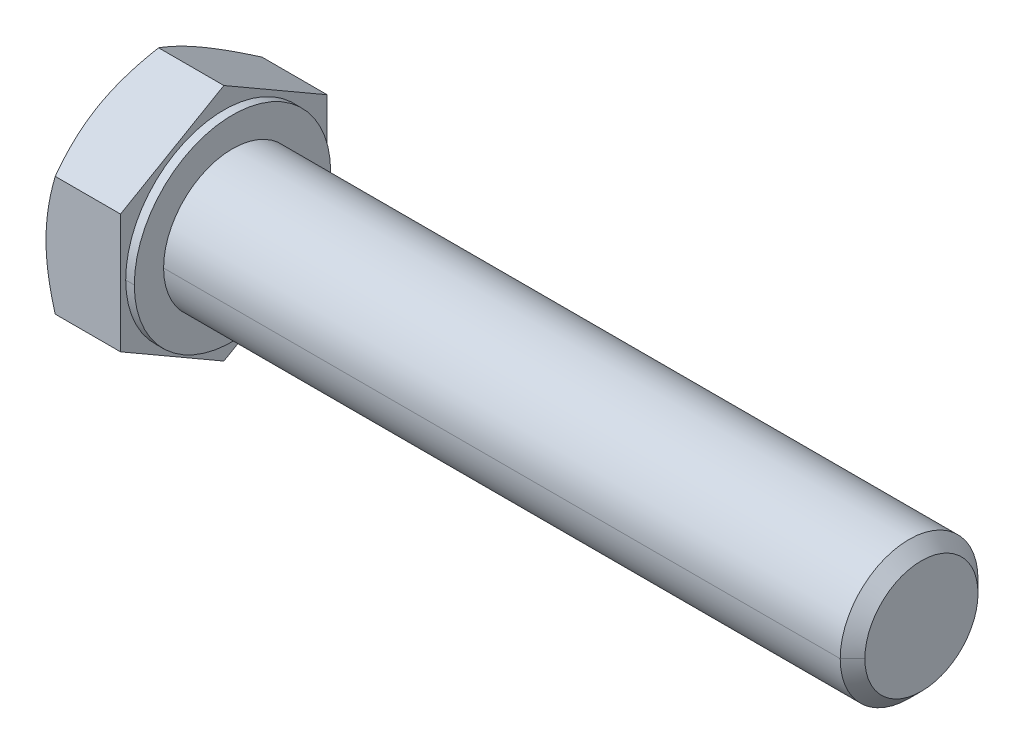
ISO-10303-21;
HEADER;
FILE_DESCRIPTION(('STEP AP214'),'2;1');
FILE_NAME('part.step','',(''),(''),'','','');
FILE_SCHEMA(('AUTOMOTIVE_DESIGN { 1 0 10303 214 1 1 1 1 }'));
ENDSEC;
DATA;
#1=APPLICATION_CONTEXT('core data for automotive mechanical design processes');
#2=APPLICATION_PROTOCOL_DEFINITION('international standard','automotive_design',2000,#1);
#3=PRODUCT_CONTEXT('',#1,'mechanical');
#4=PRODUCT('Part','Part','',(#3));
#5=PRODUCT_RELATED_PRODUCT_CATEGORY('part','',(#4));
#6=PRODUCT_DEFINITION_FORMATION('','',#4);
#7=PRODUCT_DEFINITION_CONTEXT('part definition',#1,'design');
#8=PRODUCT_DEFINITION('design','',#6,#7);
#9=PRODUCT_DEFINITION_SHAPE('','',#8);
#10=(LENGTH_UNIT() NAMED_UNIT(*) SI_UNIT(.MILLI.,.METRE.));
#11=(NAMED_UNIT(*) PLANE_ANGLE_UNIT() SI_UNIT($,.RADIAN.));
#12=(NAMED_UNIT(*) SI_UNIT($,.STERADIAN.) SOLID_ANGLE_UNIT());
#13=UNCERTAINTY_MEASURE_WITH_UNIT(LENGTH_MEASURE(1.E-05),#10,'distance_accuracy_value','');
#14=(GEOMETRIC_REPRESENTATION_CONTEXT(3) GLOBAL_UNCERTAINTY_ASSIGNED_CONTEXT((#13)) GLOBAL_UNIT_ASSIGNED_CONTEXT((#10,
#11,#12)) REPRESENTATION_CONTEXT('',''));
#15=CARTESIAN_POINT('',(0.,0.,0.));
#16=DIRECTION('',(0.,0.,1.));
#17=DIRECTION('',(1.,0.,0.));
#18=AXIS2_PLACEMENT_3D('',#15,#16,#17);
#19=CARTESIAN_POINT('',(-0.75,13.68,0.));
#20=DIRECTION('',(-1.,0.,0.));
#21=DIRECTION('',(0.,0.,1.));
#22=AXIS2_PLACEMENT_3D('',#19,#20,#21);
#23=PLANE('',#22);
#24=CARTESIAN_POINT('',(-0.75,0.,0.));
#25=DIRECTION('',(1.,0.,0.));
#26=DIRECTION('',(0.,0.,-1.));
#27=AXIS2_PLACEMENT_3D('',#24,#25,#26);
#28=CIRCLE('',#27,8.55);
#29=CARTESIAN_POINT('',(-0.75,0.,8.55));
#30=VERTEX_POINT('',#29);
#31=CARTESIAN_POINT('',(-0.75,0.,-8.55));
#32=VERTEX_POINT('',#31);
#33=EDGE_CURVE('E11',#30,#32,#28,.T.);
#34=ORIENTED_EDGE('',*,*,#33,.F.);
#35=CARTESIAN_POINT('',(-0.75,0.,0.));
#36=DIRECTION('',(1.,0.,0.));
#37=DIRECTION('',(0.,0.,-1.));
#38=AXIS2_PLACEMENT_3D('',#35,#36,#37);
#39=CIRCLE('',#38,8.55);
#40=EDGE_CURVE('E26',#32,#30,#39,.T.);
#41=ORIENTED_EDGE('',*,*,#40,.F.);
#42=EDGE_LOOP('',(#34,#41));
#43=FACE_BOUND('',#42,.T.);
#44=DIRECTION('',(0.,1.,0.));
#45=VECTOR('',#44,1.);
#46=CARTESIAN_POINT('',(-0.75,13.68,9.));
#47=LINE('',#46,#45);
#48=CARTESIAN_POINT('',(-0.75,-5.1961524227066,9.));
#49=VERTEX_POINT('',#48);
#50=CARTESIAN_POINT('',(-0.75,5.1961524227066,9.));
#51=VERTEX_POINT('',#50);
#52=EDGE_CURVE('E519',#49,#51,#47,.T.);
#53=ORIENTED_EDGE('',*,*,#52,.F.);
#54=DIRECTION('',(0.,0.499999999999983,0.866025403784449));
#55=VECTOR('',#54,1.);
#56=CARTESIAN_POINT('',(-0.75,-4.37422863406016,10.4236137618852));
#57=LINE('',#56,#55);
#58=CARTESIAN_POINT('',(-0.75,-10.392304845413,0.));
#59=VERTEX_POINT('',#58);
#60=EDGE_CURVE('E520',#59,#49,#57,.T.);
#61=ORIENTED_EDGE('',*,*,#60,.F.);
#62=DIRECTION('',(0.,-0.499999999999983,0.866025403784449));
#63=VECTOR('',#62,1.);
#64=CARTESIAN_POINT('',(-0.75,-4.37422863406016,-10.4236137618852));
#65=LINE('',#64,#63);
#66=CARTESIAN_POINT('',(-0.75,-5.1961524227066,-9.));
#67=VERTEX_POINT('',#66);
#68=EDGE_CURVE('E527',#67,#59,#65,.T.);
#69=ORIENTED_EDGE('',*,*,#68,.F.);
#70=DIRECTION('',(0.,-1.,0.));
#71=VECTOR('',#70,1.);
#72=CARTESIAN_POINT('',(-0.75,13.68,-9.));
#73=LINE('',#72,#71);
#74=CARTESIAN_POINT('',(-0.75,5.1961524227066,-9.));
#75=VERTEX_POINT('',#74);
#76=EDGE_CURVE('E540',#75,#67,#73,.T.);
#77=ORIENTED_EDGE('',*,*,#76,.F.);
#78=DIRECTION('',(0.,-0.499999999999983,-0.866025403784449));
#79=VECTOR('',#78,1.);
#80=CARTESIAN_POINT('',(-0.75,11.2142286340597,1.42361376188564));
#81=LINE('',#80,#79);
#82=CARTESIAN_POINT('',(-0.75,10.392304845413,0.));
#83=VERTEX_POINT('',#82);
#84=EDGE_CURVE('E271',#83,#75,#81,.T.);
#85=ORIENTED_EDGE('',*,*,#84,.F.);
#86=DIRECTION('',(0.,0.499999999999983,-0.866025403784449));
#87=VECTOR('',#86,1.);
#88=CARTESIAN_POINT('',(-0.75,11.2142286340597,-1.42361376188564));
#89=LINE('',#88,#87);
#90=EDGE_CURVE('E265',#51,#83,#89,.T.);
#91=ORIENTED_EDGE('',*,*,#90,.F.);
#92=EDGE_LOOP('',(#53,#61,#69,#77,#85,#91));
#93=FACE_BOUND('',#92,.T.);
#94=ADVANCED_FACE('F17',(#43,#93),#23,.F.);
#95=CARTESIAN_POINT('',(-7.5,10.392304845413,0.));
#96=DIRECTION('',(0.,0.866025403784449,0.499999999999983));
#97=DIRECTION('',(0.,-0.499999999999983,0.866025403784449));
#98=AXIS2_PLACEMENT_3D('',#95,#96,#97);
#99=PLANE('',#98);
#100=CARTESIAN_POINT('',(-6.43627813379369,10.3924203154668,-0.000200000000001183));
#101=CARTESIAN_POINT('',(-6.69621058875829,9.942219103389,0.779571372947934));
#102=CARTESIAN_POINT('',(-6.91171855275249,9.47976438328523,1.58056644436775));
#103=CARTESIAN_POINT('',(-7.19216806037815,8.55314341169682,3.18552104651779));
#104=CARTESIAN_POINT('',(-7.2580045970672,8.07792815738971,4.00861801150951));
#105=CARTESIAN_POINT('',(-7.21650725145066,7.20186794871736,5.52599880341949));
#106=CARTESIAN_POINT('',(-7.13122965941731,6.79157607035014,6.23664518268441));
#107=CARTESIAN_POINT('',(-6.85476074123532,5.98793750945468,7.62858800107694));
#108=CARTESIAN_POINT('',(-6.66244767905362,5.58776103891603,8.32171398004351));
#109=CARTESIAN_POINT('',(-6.43627813379354,5.19603695265277,9.0002));
#110=B_SPLINE_CURVE_WITH_KNOTS('',3,(#100,#101,#102,#103,#104,#105,#106,#107,#108,#109),
.UNSPECIFIED.,.F.,.F.,(4,2,2,2,4),(0.,0.267364107578722,0.534728215157443,0.767364107578722,1.),.UNSPECIFIED.);
#111=CARTESIAN_POINT('',(-6.43634480157145,10.392304845413,0.));
#112=VERTEX_POINT('',#111);
#113=CARTESIAN_POINT('',(-6.43634480157131,5.1961524227066,9.));
#114=VERTEX_POINT('',#113);
#115=EDGE_CURVE('E257',#112,#114,#110,.T.);
#116=ORIENTED_EDGE('',*,*,#115,.T.);
#117=DIRECTION('',(1.,0.,0.));
#118=VECTOR('',#117,1.);
#119=CARTESIAN_POINT('',(-7.5,5.1961524227066,9.));
#120=LINE('',#119,#118);
#121=EDGE_CURVE('E266',#114,#51,#120,.T.);
#122=ORIENTED_EDGE('',*,*,#121,.T.);
#123=ORIENTED_EDGE('',*,*,#90,.T.);
#124=DIRECTION('',(1.,0.,0.));
#125=VECTOR('',#124,1.);
#126=CARTESIAN_POINT('',(-7.5,10.392304845413,0.));
#127=LINE('',#126,#125);
#128=EDGE_CURVE('E273',#112,#83,#127,.T.);
#129=ORIENTED_EDGE('',*,*,#128,.F.);
#130=EDGE_LOOP('',(#116,#122,#123,#129));
#131=FACE_BOUND('',#130,.T.);
#132=ADVANCED_FACE('F287',(#131),#99,.T.);
#133=CARTESIAN_POINT('',(-7.5,5.1961524227066,-9.));
#134=DIRECTION('',(0.,0.866025403784449,-0.499999999999983));
#135=DIRECTION('',(0.,0.499999999999983,0.866025403784449));
#136=AXIS2_PLACEMENT_3D('',#133,#134,#135);
#137=PLANE('',#136);
#138=CARTESIAN_POINT('',(-6.43627813379354,5.19603695265276,-9.0002));
#139=CARTESIAN_POINT('',(-6.69621058875816,5.6462381647306,-8.22042862705205));
#140=CARTESIAN_POINT('',(-6.91171855275239,6.10869288483438,-7.41943355563222));
#141=CARTESIAN_POINT('',(-7.19216806037811,7.03531385642282,-5.81447895348215));
#142=CARTESIAN_POINT('',(-7.25800459706719,7.51052911072994,-4.99138198849041));
#143=CARTESIAN_POINT('',(-7.2165072514507,8.38658931940229,-3.47400119658043));
#144=CARTESIAN_POINT('',(-7.13122965941737,8.7968811977695,-2.76335481731553));
#145=CARTESIAN_POINT('',(-6.85476074123542,9.60051975866494,-1.37141199892303));
#146=CARTESIAN_POINT('',(-6.66244767905375,10.0006962292036,-0.678286019956478));
#147=CARTESIAN_POINT('',(-6.43627813379369,10.3924203154668,0.000199999999995343));
#148=B_SPLINE_CURVE_WITH_KNOTS('',3,(#138,#139,#140,#141,#142,#143,#144,#145,#146,#147),
.UNSPECIFIED.,.F.,.F.,(4,2,2,2,4),(0.,0.267364107578728,0.534728215157456,0.767364107578728,1.),.UNSPECIFIED.);
#149=CARTESIAN_POINT('',(-6.43634480157131,5.1961524227066,-9.));
#150=VERTEX_POINT('',#149);
#151=EDGE_CURVE('E248',#150,#112,#148,.T.);
#152=ORIENTED_EDGE('',*,*,#151,.T.);
#153=ORIENTED_EDGE('',*,*,#128,.T.);
#154=ORIENTED_EDGE('',*,*,#84,.T.);
#155=DIRECTION('',(1.,0.,0.));
#156=VECTOR('',#155,1.);
#157=CARTESIAN_POINT('',(-7.5,5.1961524227066,-9.));
#158=LINE('',#157,#156);
#159=EDGE_CURVE('E318',#150,#75,#158,.T.);
#160=ORIENTED_EDGE('',*,*,#159,.F.);
#161=EDGE_LOOP('',(#152,#153,#154,#160));
#162=FACE_BOUND('',#161,.T.);
#163=ADVANCED_FACE('F296',(#162),#137,.T.);
#164=CARTESIAN_POINT('',(-7.5,-5.1961524227066,-9.));
#165=DIRECTION('',(0.,0.,-1.));
#166=DIRECTION('',(-1.,0.,0.));
#167=AXIS2_PLACEMENT_3D('',#164,#165,#166);
#168=PLANE('',#167);
#169=CARTESIAN_POINT('',(-6.43634480157131,-5.1961524227066,-9.));
#170=CARTESIAN_POINT('',(-6.67588943771981,-4.36634546172701,-9.));
#171=CARTESIAN_POINT('',(-6.87778751915289,-3.51577002428983,-9.));
#172=CARTESIAN_POINT('',(-7.15707150953953,-1.81111599678029,-9.));
#173=CARTESIAN_POINT('',(-7.23588805333578,-0.938160054156006,-9.));
#174=CARTESIAN_POINT('',(-7.24013303000928,-0.0496611528889562,-9.));
#175=CARTESIAN_POINT('',(-7.24018982431486,-0.0248344339037771,-9.));
#176=CARTESIAN_POINT('',(-7.24018514357618,6.53935239292025E-10,-9.));
#177=B_SPLINE_CURVE_WITH_KNOTS('',3,(#169,#170,#171,#172,#173,#174,#175,#176),.UNSPECIFIED.,.F.,
.F.,(4,2,2,4),(0.,0.246493319722337,0.492986639444674,0.500069747080712),.UNSPECIFIED.);
#178=CARTESIAN_POINT('',(-6.43634480157131,-5.1961524227066,-9.));
#179=VERTEX_POINT('',#178);
#180=CARTESIAN_POINT('',(-7.24019237886467,0.,-9.));
#181=VERTEX_POINT('',#180);
#182=EDGE_CURVE('E323',#179,#181,#177,.T.);
#183=ORIENTED_EDGE('',*,*,#182,.T.);
#184=CARTESIAN_POINT('',(-7.24018514357618,6.53935239292025E-10,-9.));
#185=CARTESIAN_POINT('',(-7.24002229918454,0.863997899793554,-9.));
#186=CARTESIAN_POINT('',(-7.16545213405667,1.7373346045414,-9.));
#187=CARTESIAN_POINT('',(-6.88925945064517,3.46713462228718,-9.));
#188=CARTESIAN_POINT('',(-6.68270509059144,4.34273534760617,-9.));
#189=CARTESIAN_POINT('',(-6.43634480157131,5.1961524227066,-9.));
#190=B_SPLINE_CURVE_WITH_KNOTS('',3,(#184,#185,#186,#187,#188,#189),.UNSPECIFIED.,.F.,.F.,(4,2,
4),(0.500069747080712,0.746493319722337,1.),.UNSPECIFIED.);
#191=EDGE_CURVE('E328',#181,#150,#190,.T.);
#192=ORIENTED_EDGE('',*,*,#191,.T.);
#193=ORIENTED_EDGE('',*,*,#159,.T.);
#194=ORIENTED_EDGE('',*,*,#76,.T.);
#195=DIRECTION('',(1.,0.,0.));
#196=VECTOR('',#195,1.);
#197=CARTESIAN_POINT('',(-7.5,-5.1961524227066,-9.));
#198=LINE('',#197,#196);
#199=EDGE_CURVE('E352',#179,#67,#198,.T.);
#200=ORIENTED_EDGE('',*,*,#199,.F.);
#201=EDGE_LOOP('',(#183,#192,#193,#194,#200));
#202=FACE_BOUND('',#201,.T.);
#203=ADVANCED_FACE('F300',(#202),#168,.T.);
#204=CARTESIAN_POINT('',(-7.5,-10.392304845413,0.));
#205=DIRECTION('',(0.,-0.866025403784449,-0.499999999999983));
#206=DIRECTION('',(0.,0.499999999999983,-0.866025403784449));
#207=AXIS2_PLACEMENT_3D('',#204,#205,#206);
#208=PLANE('',#207);
#209=CARTESIAN_POINT('',(-6.43627813379369,-10.3924203154668,0.000200000000001183));
#210=CARTESIAN_POINT('',(-6.69621058875829,-9.942219103389,-0.779571372947934));
#211=CARTESIAN_POINT('',(-6.91171855275249,-9.47976438328523,-1.58056644436775));
#212=CARTESIAN_POINT('',(-7.19216806037815,-8.55314341169682,-3.18552104651779));
#213=CARTESIAN_POINT('',(-7.2580045970672,-8.07792815738971,-4.00861801150951));
#214=CARTESIAN_POINT('',(-7.21650725145066,-7.20186794871736,-5.52599880341949));
#215=CARTESIAN_POINT('',(-7.13122965941731,-6.79157607035014,-6.23664518268441));
#216=CARTESIAN_POINT('',(-6.85476074123532,-5.98793750945468,-7.62858800107694));
#217=CARTESIAN_POINT('',(-6.66244767905362,-5.58776103891603,-8.32171398004351));
#218=CARTESIAN_POINT('',(-6.43627813379354,-5.19603695265277,-9.0002));
#219=B_SPLINE_CURVE_WITH_KNOTS('',3,(#209,#210,#211,#212,#213,#214,#215,#216,#217,#218),
.UNSPECIFIED.,.F.,.F.,(4,2,2,2,4),(0.,0.267364107578722,0.534728215157443,0.767364107578722,1.),.UNSPECIFIED.);
#220=CARTESIAN_POINT('',(-6.43634480157145,-10.392304845413,0.));
#221=VERTEX_POINT('',#220);
#222=EDGE_CURVE('E356',#221,#179,#219,.T.);
#223=ORIENTED_EDGE('',*,*,#222,.T.);
#224=ORIENTED_EDGE('',*,*,#199,.T.);
#225=ORIENTED_EDGE('',*,*,#68,.T.);
#226=DIRECTION('',(1.,0.,0.));
#227=VECTOR('',#226,1.);
#228=CARTESIAN_POINT('',(-7.5,-10.392304845413,0.));
#229=LINE('',#228,#227);
#230=EDGE_CURVE('E397',#221,#59,#229,.T.);
#231=ORIENTED_EDGE('',*,*,#230,.F.);
#232=EDGE_LOOP('',(#223,#224,#225,#231));
#233=FACE_BOUND('',#232,.T.);
#234=ADVANCED_FACE('F366',(#233),#208,.T.);
#235=CARTESIAN_POINT('',(-7.5,-5.1961524227066,9.));
#236=DIRECTION('',(0.,-0.866025403784449,0.499999999999983));
#237=DIRECTION('',(0.,-0.499999999999983,-0.866025403784449));
#238=AXIS2_PLACEMENT_3D('',#235,#236,#237);
#239=PLANE('',#238);
#240=CARTESIAN_POINT('',(-6.43627813379354,-5.19603695265276,9.0002));
#241=CARTESIAN_POINT('',(-6.69621058875816,-5.6462381647306,8.22042862705205));
#242=CARTESIAN_POINT('',(-6.91171855275239,-6.10869288483438,7.41943355563222));
#243=CARTESIAN_POINT('',(-7.19216806037811,-7.03531385642282,5.81447895348215));
#244=CARTESIAN_POINT('',(-7.25800459706719,-7.51052911072994,4.99138198849041));
#245=CARTESIAN_POINT('',(-7.21650725145069,-8.38658931940229,3.47400119658043));
#246=CARTESIAN_POINT('',(-7.13122965941737,-8.7968811977695,2.76335481731553));
#247=CARTESIAN_POINT('',(-6.85476074123542,-9.60051975866494,1.37141199892303));
#248=CARTESIAN_POINT('',(-6.66244767905375,-10.0006962292036,0.678286019956478));
#249=CARTESIAN_POINT('',(-6.43627813379369,-10.3924203154668,-0.000199999999995343));
#250=B_SPLINE_CURVE_WITH_KNOTS('',3,(#240,#241,#242,#243,#244,#245,#246,#247,#248,#249),
.UNSPECIFIED.,.F.,.F.,(4,2,2,2,4),(0.,0.267364107578728,0.534728215157456,0.767364107578728,1.),.UNSPECIFIED.);
#251=CARTESIAN_POINT('',(-6.43634480157131,-5.1961524227066,9.));
#252=VERTEX_POINT('',#251);
#253=EDGE_CURVE('E396',#252,#221,#250,.T.);
#254=ORIENTED_EDGE('',*,*,#253,.T.);
#255=ORIENTED_EDGE('',*,*,#230,.T.);
#256=ORIENTED_EDGE('',*,*,#60,.T.);
#257=DIRECTION('',(1.,0.,0.));
#258=VECTOR('',#257,1.);
#259=CARTESIAN_POINT('',(-7.5,-5.1961524227066,9.));
#260=LINE('',#259,#258);
#261=EDGE_CURVE('E404',#252,#49,#260,.T.);
#262=ORIENTED_EDGE('',*,*,#261,.F.);
#263=EDGE_LOOP('',(#254,#255,#256,#262));
#264=FACE_BOUND('',#263,.T.);
#265=ADVANCED_FACE('F375',(#264),#239,.T.);
#266=CARTESIAN_POINT('',(-7.5,5.1961524227066,9.));
#267=DIRECTION('',(0.,0.,1.));
#268=DIRECTION('',(1.,0.,0.));
#269=AXIS2_PLACEMENT_3D('',#266,#267,#268);
#270=PLANE('',#269);
#271=CARTESIAN_POINT('',(-6.43634480157131,5.1961524227066,9.));
#272=CARTESIAN_POINT('',(-6.67588943771981,4.36634546172701,9.));
#273=CARTESIAN_POINT('',(-6.87778751915289,3.51577002428983,9.));
#274=CARTESIAN_POINT('',(-7.15707150953953,1.81111599678029,9.));
#275=CARTESIAN_POINT('',(-7.23588805333578,0.938160054156006,9.));
#276=CARTESIAN_POINT('',(-7.24013303000928,0.0496611528889562,9.));
#277=CARTESIAN_POINT('',(-7.24018982431486,0.0248344339037762,9.));
#278=CARTESIAN_POINT('',(-7.24018514357618,-6.53935239292025E-10,9.));
#279=B_SPLINE_CURVE_WITH_KNOTS('',3,(#271,#272,#273,#274,#275,#276,#277,#278),.UNSPECIFIED.,.F.,
.F.,(4,2,2,4),(0.,0.246493319722337,0.492986639444674,0.500069747080712),.UNSPECIFIED.);
#280=CARTESIAN_POINT('',(-7.24019237886467,0.,9.));
#281=VERTEX_POINT('',#280);
#282=EDGE_CURVE('E259',#114,#281,#279,.T.);
#283=ORIENTED_EDGE('',*,*,#282,.T.);
#284=CARTESIAN_POINT('',(-7.24018514357618,-6.53935239292025E-10,9.));
#285=CARTESIAN_POINT('',(-7.24002229918454,-0.863997899793554,9.));
#286=CARTESIAN_POINT('',(-7.16545213405667,-1.7373346045414,9.));
#287=CARTESIAN_POINT('',(-6.88925945064517,-3.46713462228718,9.));
#288=CARTESIAN_POINT('',(-6.68270509059144,-4.34273534760617,9.));
#289=CARTESIAN_POINT('',(-6.43634480157131,-5.1961524227066,9.));
#290=B_SPLINE_CURVE_WITH_KNOTS('',3,(#284,#285,#286,#287,#288,#289),.UNSPECIFIED.,.F.,.F.,(4,2,
4),(0.500069747080712,0.746493319722337,1.),.UNSPECIFIED.);
#291=EDGE_CURVE('E412',#281,#252,#290,.T.);
#292=ORIENTED_EDGE('',*,*,#291,.T.);
#293=ORIENTED_EDGE('',*,*,#261,.T.);
#294=ORIENTED_EDGE('',*,*,#52,.T.);
#295=ORIENTED_EDGE('',*,*,#121,.F.);
#296=EDGE_LOOP('',(#283,#292,#293,#294,#295));
#297=FACE_BOUND('',#296,.T.);
#298=ADVANCED_FACE('F378',(#297),#270,.T.);
#299=CARTESIAN_POINT('',(-7.5,0.,0.));
#300=DIRECTION('',(1.,0.,0.));
#301=DIRECTION('',(0.,1.,0.));
#302=AXIS2_PLACEMENT_3D('',#299,#300,#301);
#303=CONICAL_SURFACE('',#302,8.55,1.0471975511966);
#304=DIRECTION('',(0.500000000000001,0.,0.866025403784438));
#305=VECTOR('',#304,1.);
#306=CARTESIAN_POINT('',(-7.5,0.,8.55));
#307=LINE('',#306,#305);
#308=CARTESIAN_POINT('',(-7.5,0.,8.55));
#309=VERTEX_POINT('',#308);
#310=EDGE_CURVE('E435',#309,#281,#307,.T.);
#311=ORIENTED_EDGE('',*,*,#310,.F.);
#312=CARTESIAN_POINT('',(-7.5,0.,0.));
#313=DIRECTION('',(1.,0.,0.));
#314=DIRECTION('',(0.,0.,-1.));
#315=AXIS2_PLACEMENT_3D('',#312,#313,#314);
#316=CIRCLE('',#315,8.55);
#317=CARTESIAN_POINT('',(-7.5,0.,-8.55));
#318=VERTEX_POINT('',#317);
#319=EDGE_CURVE('E438',#309,#318,#316,.T.);
#320=ORIENTED_EDGE('',*,*,#319,.T.);
#321=DIRECTION('',(0.500000000000001,0.,-0.866025403784438));
#322=VECTOR('',#321,1.);
#323=CARTESIAN_POINT('',(-7.5,0.,-8.55));
#324=LINE('',#323,#322);
#325=EDGE_CURVE('E203',#318,#181,#324,.T.);
#326=ORIENTED_EDGE('',*,*,#325,.T.);
#327=ORIENTED_EDGE('',*,*,#182,.F.);
#328=ORIENTED_EDGE('',*,*,#222,.F.);
#329=ORIENTED_EDGE('',*,*,#253,.F.);
#330=ORIENTED_EDGE('',*,*,#291,.F.);
#331=EDGE_LOOP('',(#311,#320,#326,#327,#328,#329,#330));
#332=FACE_BOUND('',#331,.T.);
#333=ADVANCED_FACE('F223',(#332),#303,.T.);
#334=CARTESIAN_POINT('',(-7.5,0.,0.));
#335=DIRECTION('',(1.,0.,0.));
#336=DIRECTION('',(0.,-1.,0.));
#337=AXIS2_PLACEMENT_3D('',#334,#335,#336);
#338=CONICAL_SURFACE('',#337,8.55,1.0471975511966);
#339=ORIENTED_EDGE('',*,*,#310,.T.);
#340=ORIENTED_EDGE('',*,*,#282,.F.);
#341=ORIENTED_EDGE('',*,*,#115,.F.);
#342=ORIENTED_EDGE('',*,*,#151,.F.);
#343=ORIENTED_EDGE('',*,*,#191,.F.);
#344=ORIENTED_EDGE('',*,*,#325,.F.);
#345=CARTESIAN_POINT('',(-7.5,0.,0.));
#346=DIRECTION('',(1.,0.,0.));
#347=DIRECTION('',(0.,0.,-1.));
#348=AXIS2_PLACEMENT_3D('',#345,#346,#347);
#349=CIRCLE('',#348,8.55);
#350=EDGE_CURVE('E197',#318,#309,#349,.T.);
#351=ORIENTED_EDGE('',*,*,#350,.T.);
#352=EDGE_LOOP('',(#339,#340,#341,#342,#343,#344,#351));
#353=FACE_BOUND('',#352,.T.);
#354=ADVANCED_FACE('F212',(#353),#338,.T.);
#355=CARTESIAN_POINT('',(-7.5,0.,0.));
#356=DIRECTION('',(1.,0.,0.));
#357=DIRECTION('',(0.,0.,-1.));
#358=AXIS2_PLACEMENT_3D('',#355,#356,#357);
#359=PLANE('',#358);
#360=ORIENTED_EDGE('',*,*,#319,.F.);
#361=ORIENTED_EDGE('',*,*,#350,.F.);
#362=EDGE_LOOP('',(#360,#361));
#363=FACE_BOUND('',#362,.T.);
#364=ADVANCED_FACE('F222',(#363),#359,.F.);
#365=CARTESIAN_POINT('',(60.,0.,0.));
#366=DIRECTION('',(1.,0.,0.));
#367=DIRECTION('',(0.,-1.,0.));
#368=AXIS2_PLACEMENT_3D('',#365,#366,#367);
#369=CYLINDRICAL_SURFACE('',#368,8.55);
#370=DIRECTION('',(1.,0.,0.));
#371=VECTOR('',#370,1.);
#372=CARTESIAN_POINT('',(-0.75,0.,8.55));
#373=LINE('',#372,#371);
#374=CARTESIAN_POINT('',(0.,0.,8.55));
#375=VERTEX_POINT('',#374);
#376=EDGE_CURVE('E192',#30,#375,#373,.T.);
#377=ORIENTED_EDGE('',*,*,#376,.T.);
#378=CARTESIAN_POINT('',(0.,0.,0.));
#379=DIRECTION('',(1.,0.,0.));
#380=DIRECTION('',(0.,0.,-1.));
#381=AXIS2_PLACEMENT_3D('',#378,#379,#380);
#382=CIRCLE('',#381,8.55);
#383=CARTESIAN_POINT('',(0.,0.,-8.55));
#384=VERTEX_POINT('',#383);
#385=EDGE_CURVE('E186',#384,#375,#382,.T.);
#386=ORIENTED_EDGE('',*,*,#385,.F.);
#387=DIRECTION('',(1.,0.,0.));
#388=VECTOR('',#387,1.);
#389=CARTESIAN_POINT('',(-0.75,0.,-8.55));
#390=LINE('',#389,#388);
#391=EDGE_CURVE('E180',#32,#384,#390,.T.);
#392=ORIENTED_EDGE('',*,*,#391,.F.);
#393=ORIENTED_EDGE('',*,*,#40,.T.);
#394=EDGE_LOOP('',(#377,#386,#392,#393));
#395=FACE_BOUND('',#394,.T.);
#396=ADVANCED_FACE('F509',(#395),#369,.T.);
#397=CARTESIAN_POINT('',(60.,0.,0.));
#398=DIRECTION('',(1.,0.,0.));
#399=DIRECTION('',(0.,1.,0.));
#400=AXIS2_PLACEMENT_3D('',#397,#398,#399);
#401=CYLINDRICAL_SURFACE('',#400,8.55);
#402=ORIENTED_EDGE('',*,*,#376,.F.);
#403=ORIENTED_EDGE('',*,*,#33,.T.);
#404=ORIENTED_EDGE('',*,*,#391,.T.);
#405=CARTESIAN_POINT('',(0.,0.,0.));
#406=DIRECTION('',(1.,0.,0.));
#407=DIRECTION('',(0.,0.,-1.));
#408=AXIS2_PLACEMENT_3D('',#405,#406,#407);
#409=CIRCLE('',#408,8.55);
#410=EDGE_CURVE('E174',#375,#384,#409,.T.);
#411=ORIENTED_EDGE('',*,*,#410,.F.);
#412=EDGE_LOOP('',(#402,#403,#404,#411));
#413=FACE_BOUND('',#412,.T.);
#414=ADVANCED_FACE('F513',(#413),#401,.T.);
#415=CARTESIAN_POINT('',(0.,8.55,0.));
#416=DIRECTION('',(-1.,0.,0.));
#417=DIRECTION('',(0.,0.,1.));
#418=AXIS2_PLACEMENT_3D('',#415,#416,#417);
#419=PLANE('',#418);
#420=CARTESIAN_POINT('',(0.,0.,0.));
#421=DIRECTION('',(1.,0.,0.));
#422=DIRECTION('',(0.,0.,-1.));
#423=AXIS2_PLACEMENT_3D('',#420,#421,#422);
#424=CIRCLE('',#423,6.);
#425=CARTESIAN_POINT('',(0.,0.,6.));
#426=VERTEX_POINT('',#425);
#427=CARTESIAN_POINT('',(0.,0.,-6.));
#428=VERTEX_POINT('',#427);
#429=EDGE_CURVE('E168',#426,#428,#424,.T.);
#430=ORIENTED_EDGE('',*,*,#429,.F.);
#431=CARTESIAN_POINT('',(0.,0.,0.));
#432=DIRECTION('',(1.,0.,0.));
#433=DIRECTION('',(0.,0.,-1.));
#434=AXIS2_PLACEMENT_3D('',#431,#432,#433);
#435=CIRCLE('',#434,6.);
#436=EDGE_CURVE('E162',#428,#426,#435,.T.);
#437=ORIENTED_EDGE('',*,*,#436,.F.);
#438=EDGE_LOOP('',(#430,#437));
#439=FACE_BOUND('',#438,.T.);
#440=ORIENTED_EDGE('',*,*,#385,.T.);
#441=ORIENTED_EDGE('',*,*,#410,.T.);
#442=EDGE_LOOP('',(#440,#441));
#443=FACE_BOUND('',#442,.T.);
#444=ADVANCED_FACE('F602',(#439,#443),#419,.F.);
#445=CARTESIAN_POINT('',(60.,0.,0.));
#446=DIRECTION('',(1.,0.,0.));
#447=DIRECTION('',(0.,-1.,0.));
#448=AXIS2_PLACEMENT_3D('',#445,#446,#447);
#449=CYLINDRICAL_SURFACE('',#448,6.);
#450=DIRECTION('',(1.,0.,0.));
#451=VECTOR('',#450,1.);
#452=CARTESIAN_POINT('',(0.,0.,6.));
#453=LINE('',#452,#451);
#454=CARTESIAN_POINT('',(58.9265,0.,6.));
#455=VERTEX_POINT('',#454);
#456=EDGE_CURVE('E157',#426,#455,#453,.T.);
#457=ORIENTED_EDGE('',*,*,#456,.T.);
#458=CARTESIAN_POINT('',(58.9265,0.,0.));
#459=DIRECTION('',(1.,0.,0.));
#460=DIRECTION('',(0.,0.,-1.));
#461=AXIS2_PLACEMENT_3D('',#458,#459,#460);
#462=CIRCLE('',#461,6.);
#463=CARTESIAN_POINT('',(58.9265,0.,-6.));
#464=VERTEX_POINT('',#463);
#465=EDGE_CURVE('E128',#464,#455,#462,.T.);
#466=ORIENTED_EDGE('',*,*,#465,.F.);
#467=DIRECTION('',(1.,0.,0.));
#468=VECTOR('',#467,1.);
#469=CARTESIAN_POINT('',(0.,0.,-6.));
#470=LINE('',#469,#468);
#471=EDGE_CURVE('E147',#428,#464,#470,.T.);
#472=ORIENTED_EDGE('',*,*,#471,.F.);
#473=ORIENTED_EDGE('',*,*,#436,.T.);
#474=EDGE_LOOP('',(#457,#466,#472,#473));
#475=FACE_BOUND('',#474,.T.);
#476=ADVANCED_FACE('F612',(#475),#449,.T.);
#477=CARTESIAN_POINT('',(60.,0.,0.));
#478=DIRECTION('',(1.,0.,0.));
#479=DIRECTION('',(0.,1.,0.));
#480=AXIS2_PLACEMENT_3D('',#477,#478,#479);
#481=CYLINDRICAL_SURFACE('',#480,6.);
#482=ORIENTED_EDGE('',*,*,#456,.F.);
#483=ORIENTED_EDGE('',*,*,#429,.T.);
#484=ORIENTED_EDGE('',*,*,#471,.T.);
#485=CARTESIAN_POINT('',(58.9265,0.,0.));
#486=DIRECTION('',(1.,0.,0.));
#487=DIRECTION('',(0.,0.,-1.));
#488=AXIS2_PLACEMENT_3D('',#485,#486,#487);
#489=CIRCLE('',#488,6.);
#490=EDGE_CURVE('E142',#455,#464,#489,.T.);
#491=ORIENTED_EDGE('',*,*,#490,.F.);
#492=EDGE_LOOP('',(#482,#483,#484,#491));
#493=FACE_BOUND('',#492,.T.);
#494=ADVANCED_FACE('F622',(#493),#481,.T.);
#495=CARTESIAN_POINT('',(58.9265,0.,0.));
#496=DIRECTION('',(-1.,0.,0.));
#497=DIRECTION('',(0.,1.,0.));
#498=AXIS2_PLACEMENT_3D('',#495,#496,#497);
#499=CONICAL_SURFACE('',#498,6.,0.785398163397446);
#500=DIRECTION('',(-0.707106781186549,0.,-0.707106781186546));
#501=VECTOR('',#500,1.);
#502=CARTESIAN_POINT('',(60.,0.,-4.9265));
#503=LINE('',#502,#501);
#504=CARTESIAN_POINT('',(60.,0.,-4.9265));
#505=VERTEX_POINT('',#504);
#506=EDGE_CURVE('E117',#505,#464,#503,.T.);
#507=ORIENTED_EDGE('',*,*,#506,.F.);
#508=CARTESIAN_POINT('',(60.,0.,0.));
#509=DIRECTION('',(1.,0.,0.));
#510=DIRECTION('',(0.,0.,-1.));
#511=AXIS2_PLACEMENT_3D('',#508,#509,#510);
#512=CIRCLE('',#511,4.9265);
#513=CARTESIAN_POINT('',(60.,0.,4.9265));
#514=VERTEX_POINT('',#513);
#515=EDGE_CURVE('E109',#514,#505,#512,.T.);
#516=ORIENTED_EDGE('',*,*,#515,.F.);
#517=DIRECTION('',(-0.707106781186549,0.,0.707106781186546));
#518=VECTOR('',#517,1.);
#519=CARTESIAN_POINT('',(60.,0.,4.9265));
#520=LINE('',#519,#518);
#521=EDGE_CURVE('E114',#514,#455,#520,.T.);
#522=ORIENTED_EDGE('',*,*,#521,.T.);
#523=ORIENTED_EDGE('',*,*,#490,.T.);
#524=EDGE_LOOP('',(#507,#516,#522,#523));
#525=FACE_BOUND('',#524,.T.);
#526=ADVANCED_FACE('F111',(#525),#499,.T.);
#527=CARTESIAN_POINT('',(58.9265,0.,0.));
#528=DIRECTION('',(-1.,0.,0.));
#529=DIRECTION('',(0.,-1.,0.));
#530=AXIS2_PLACEMENT_3D('',#527,#528,#529);
#531=CONICAL_SURFACE('',#530,6.,0.785398163397446);
#532=ORIENTED_EDGE('',*,*,#506,.T.);
#533=ORIENTED_EDGE('',*,*,#465,.T.);
#534=ORIENTED_EDGE('',*,*,#521,.F.);
#535=CARTESIAN_POINT('',(60.,0.,0.));
#536=DIRECTION('',(1.,0.,0.));
#537=DIRECTION('',(0.,0.,-1.));
#538=AXIS2_PLACEMENT_3D('',#535,#536,#537);
#539=CIRCLE('',#538,4.9265);
#540=EDGE_CURVE('E122',#505,#514,#539,.T.);
#541=ORIENTED_EDGE('',*,*,#540,.F.);
#542=EDGE_LOOP('',(#532,#533,#534,#541));
#543=FACE_BOUND('',#542,.T.);
#544=ADVANCED_FACE('F127',(#543),#531,.T.);
#545=CARTESIAN_POINT('',(60.,4.9265,0.));
#546=DIRECTION('',(-1.,0.,0.));
#547=DIRECTION('',(0.,0.,1.));
#548=AXIS2_PLACEMENT_3D('',#545,#546,#547);
#549=PLANE('',#548);
#550=ORIENTED_EDGE('',*,*,#540,.T.);
#551=ORIENTED_EDGE('',*,*,#515,.T.);
#552=EDGE_LOOP('',(#550,#551));
#553=FACE_BOUND('',#552,.T.);
#554=ADVANCED_FACE('F123',(#553),#549,.F.);
#555=CLOSED_SHELL('',(#94,#132,#163,#203,#234,#265,#298,#333,#354,#364,#396,#414,#444,#476,#494,
#526,#544,#554));
#556=MANIFOLD_SOLID_BREP('B1',#555);
#557=ADVANCED_BREP_SHAPE_REPRESENTATION('',(#18,#556),#14);
#558=SHAPE_DEFINITION_REPRESENTATION(#9,#557);
ENDSEC;
END-ISO-10303-21;
